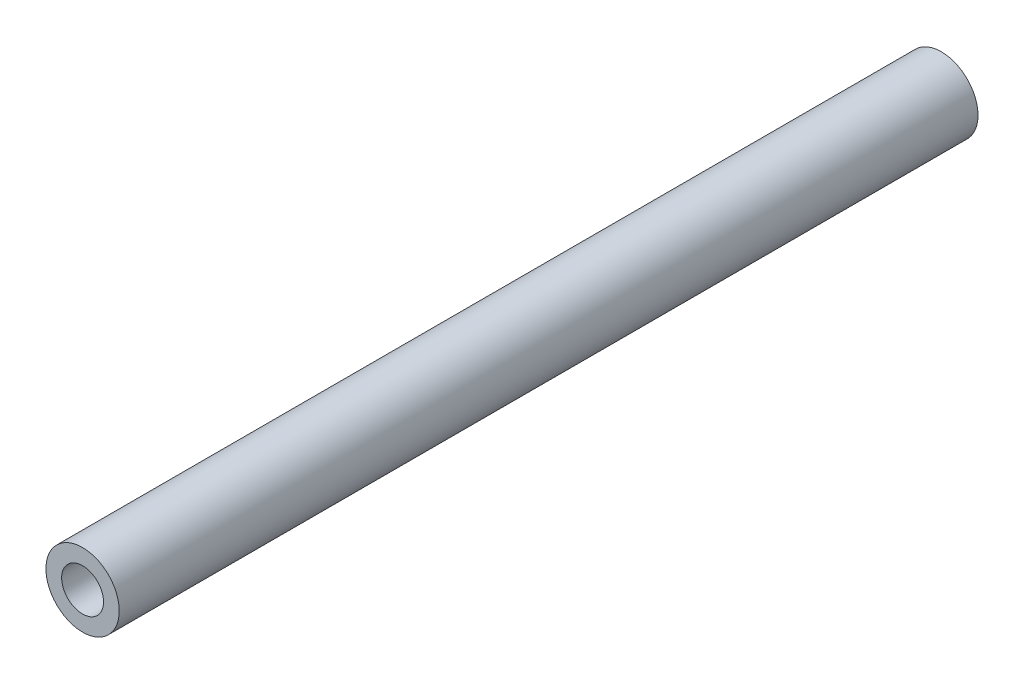
ISO-10303-21;
HEADER;
FILE_DESCRIPTION(('STEP AP214'),'2;1');
FILE_NAME('part.step','',(''),(''),'','','');
FILE_SCHEMA(('AUTOMOTIVE_DESIGN { 1 0 10303 214 1 1 1 1 }'));
ENDSEC;
DATA;
#1=APPLICATION_CONTEXT('core data for automotive mechanical design processes');
#2=APPLICATION_PROTOCOL_DEFINITION('international standard','automotive_design',2000,#1);
#3=PRODUCT_CONTEXT('',#1,'mechanical');
#4=PRODUCT('Part','Part','',(#3));
#5=PRODUCT_RELATED_PRODUCT_CATEGORY('part','',(#4));
#6=PRODUCT_DEFINITION_FORMATION('','',#4);
#7=PRODUCT_DEFINITION_CONTEXT('part definition',#1,'design');
#8=PRODUCT_DEFINITION('design','',#6,#7);
#9=PRODUCT_DEFINITION_SHAPE('','',#8);
#10=(LENGTH_UNIT() NAMED_UNIT(*) SI_UNIT(.MILLI.,.METRE.));
#11=(NAMED_UNIT(*) PLANE_ANGLE_UNIT() SI_UNIT($,.RADIAN.));
#12=(NAMED_UNIT(*) SI_UNIT($,.STERADIAN.) SOLID_ANGLE_UNIT());
#13=UNCERTAINTY_MEASURE_WITH_UNIT(LENGTH_MEASURE(1.E-05),#10,'distance_accuracy_value','');
#14=(GEOMETRIC_REPRESENTATION_CONTEXT(3) GLOBAL_UNCERTAINTY_ASSIGNED_CONTEXT((#13)) GLOBAL_UNIT_ASSIGNED_CONTEXT((#10,
#11,#12)) REPRESENTATION_CONTEXT('',''));
#15=CARTESIAN_POINT('',(0.,0.,0.));
#16=DIRECTION('',(0.,0.,1.));
#17=DIRECTION('',(1.,0.,0.));
#18=AXIS2_PLACEMENT_3D('',#15,#16,#17);
#19=CARTESIAN_POINT('',(-15.9821250755871,183.959163507542,82.));
#20=DIRECTION('',(0.,0.,1.));
#21=DIRECTION('',(1.,0.,0.));
#22=AXIS2_PLACEMENT_3D('',#19,#20,#21);
#23=PLANE('',#22);
#24=CARTESIAN_POINT('',(-15.9821250755871,183.959163507542,82.));
#25=DIRECTION('',(0.,0.,1.));
#26=DIRECTION('',(1.,0.,0.));
#27=AXIS2_PLACEMENT_3D('',#24,#25,#26);
#28=CIRCLE('',#27,3.5);
#29=CARTESIAN_POINT('',(-12.4821250755871,183.959163507542,82.));
#30=VERTEX_POINT('',#29);
#31=EDGE_CURVE('E10',#30,#30,#28,.T.);
#32=ORIENTED_EDGE('',*,*,#31,.T.);
#33=EDGE_LOOP('',(#32));
#34=FACE_BOUND('',#33,.T.);
#35=CARTESIAN_POINT('',(-15.9821250755871,183.959163507542,82.));
#36=DIRECTION('',(0.,0.,1.));
#37=DIRECTION('',(1.,0.,0.));
#38=AXIS2_PLACEMENT_3D('',#35,#36,#37);
#39=CIRCLE('',#38,2.);
#40=CARTESIAN_POINT('',(-13.9821250755871,183.959163507542,82.));
#41=VERTEX_POINT('',#40);
#42=EDGE_CURVE('E42',#41,#41,#39,.T.);
#43=ORIENTED_EDGE('',*,*,#42,.F.);
#44=EDGE_LOOP('',(#43));
#45=FACE_BOUND('',#44,.T.);
#46=ADVANCED_FACE('F31',(#34,#45),#23,.T.);
#47=CARTESIAN_POINT('',(-15.9821250755871,183.959163507542,0.));
#48=DIRECTION('',(0.,0.,1.));
#49=DIRECTION('',(1.,0.,0.));
#50=AXIS2_PLACEMENT_3D('',#47,#48,#49);
#51=PLANE('',#50);
#52=CARTESIAN_POINT('',(-15.9821250755871,183.959163507542,0.));
#53=DIRECTION('',(0.,0.,1.));
#54=DIRECTION('',(1.,0.,0.));
#55=AXIS2_PLACEMENT_3D('',#52,#53,#54);
#56=CIRCLE('',#55,3.5);
#57=CARTESIAN_POINT('',(-12.4821250755871,183.959163507542,0.));
#58=VERTEX_POINT('',#57);
#59=EDGE_CURVE('E35',#58,#58,#56,.T.);
#60=ORIENTED_EDGE('',*,*,#59,.F.);
#61=EDGE_LOOP('',(#60));
#62=FACE_BOUND('',#61,.T.);
#63=CARTESIAN_POINT('',(-15.9821250755871,183.959163507542,0.));
#64=DIRECTION('',(0.,0.,1.));
#65=DIRECTION('',(1.,0.,0.));
#66=AXIS2_PLACEMENT_3D('',#63,#64,#65);
#67=CIRCLE('',#66,2.);
#68=CARTESIAN_POINT('',(-13.9821250755871,183.959163507542,0.));
#69=VERTEX_POINT('',#68);
#70=EDGE_CURVE('E44',#69,#69,#67,.T.);
#71=ORIENTED_EDGE('',*,*,#70,.T.);
#72=EDGE_LOOP('',(#71));
#73=FACE_BOUND('',#72,.T.);
#74=ADVANCED_FACE('F54',(#62,#73),#51,.F.);
#75=CARTESIAN_POINT('',(-15.9821250755871,183.959163507542,82.));
#76=DIRECTION('',(0.,0.,-1.));
#77=DIRECTION('',(-1.,0.,0.));
#78=AXIS2_PLACEMENT_3D('',#75,#76,#77);
#79=CYLINDRICAL_SURFACE('',#78,3.5);
#80=ORIENTED_EDGE('',*,*,#31,.F.);
#81=EDGE_LOOP('',(#80));
#82=FACE_BOUND('',#81,.T.);
#83=ORIENTED_EDGE('',*,*,#59,.T.);
#84=EDGE_LOOP('',(#83));
#85=FACE_BOUND('',#84,.T.);
#86=ADVANCED_FACE('F33',(#82,#85),#79,.T.);
#87=CARTESIAN_POINT('',(-15.9821250755871,183.959163507542,82.));
#88=DIRECTION('',(0.,0.,-1.));
#89=DIRECTION('',(-1.,0.,0.));
#90=AXIS2_PLACEMENT_3D('',#87,#88,#89);
#91=CYLINDRICAL_SURFACE('',#90,2.);
#92=ORIENTED_EDGE('',*,*,#42,.T.);
#93=EDGE_LOOP('',(#92));
#94=FACE_BOUND('',#93,.T.);
#95=ORIENTED_EDGE('',*,*,#70,.F.);
#96=EDGE_LOOP('',(#95));
#97=FACE_BOUND('',#96,.T.);
#98=ADVANCED_FACE('F50',(#94,#97),#91,.F.);
#99=CLOSED_SHELL('',(#46,#74,#86,#98));
#100=MANIFOLD_SOLID_BREP('B2',#99);
#101=ADVANCED_BREP_SHAPE_REPRESENTATION('',(#18,#100),#14);
#102=SHAPE_DEFINITION_REPRESENTATION(#9,#101);
ENDSEC;
END-ISO-10303-21;
